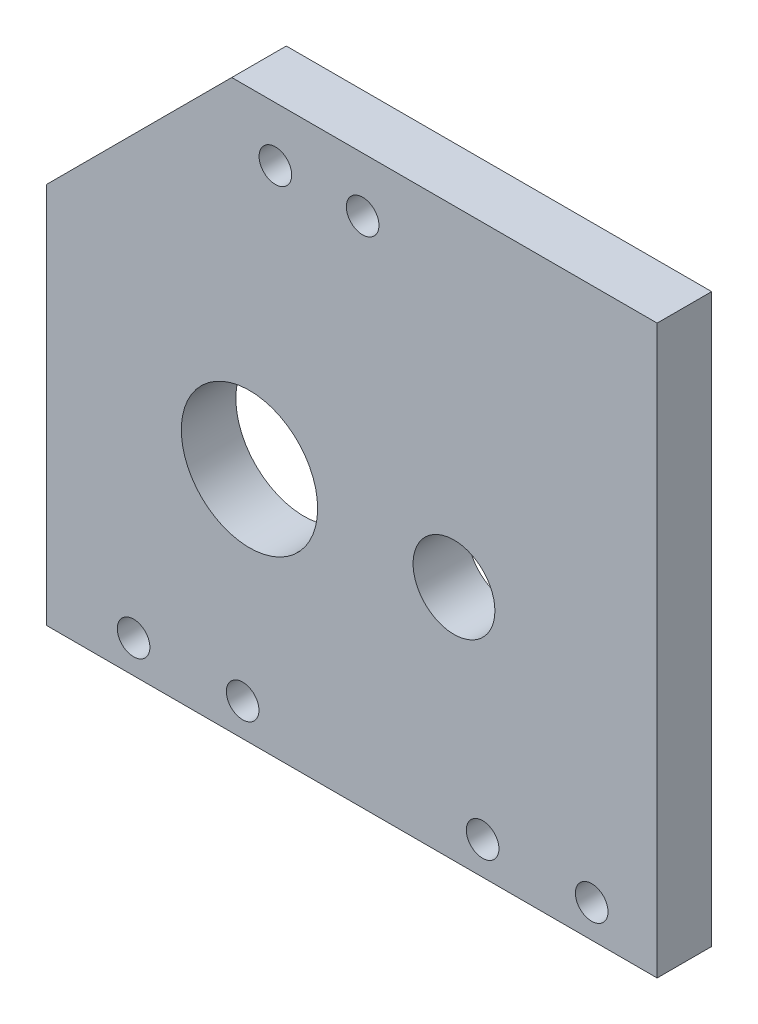
ISO-10303-21;
HEADER;
FILE_DESCRIPTION(('STEP AP214'),'2;1');
FILE_NAME('part.step','',(''),(''),'','','');
FILE_SCHEMA(('AUTOMOTIVE_DESIGN { 1 0 10303 214 1 1 1 1 }'));
ENDSEC;
DATA;
#1=APPLICATION_CONTEXT('core data for automotive mechanical design processes');
#2=APPLICATION_PROTOCOL_DEFINITION('international standard','automotive_design',2000,#1);
#3=PRODUCT_CONTEXT('',#1,'mechanical');
#4=PRODUCT('Part','Part','',(#3));
#5=PRODUCT_RELATED_PRODUCT_CATEGORY('part','',(#4));
#6=PRODUCT_DEFINITION_FORMATION('','',#4);
#7=PRODUCT_DEFINITION_CONTEXT('part definition',#1,'design');
#8=PRODUCT_DEFINITION('design','',#6,#7);
#9=PRODUCT_DEFINITION_SHAPE('','',#8);
#10=(LENGTH_UNIT() NAMED_UNIT(*) SI_UNIT(.MILLI.,.METRE.));
#11=(NAMED_UNIT(*) PLANE_ANGLE_UNIT() SI_UNIT($,.RADIAN.));
#12=(NAMED_UNIT(*) SI_UNIT($,.STERADIAN.) SOLID_ANGLE_UNIT());
#13=UNCERTAINTY_MEASURE_WITH_UNIT(LENGTH_MEASURE(1.E-05),#10,'distance_accuracy_value','');
#14=(GEOMETRIC_REPRESENTATION_CONTEXT(3) GLOBAL_UNCERTAINTY_ASSIGNED_CONTEXT((#13)) GLOBAL_UNIT_ASSIGNED_CONTEXT((#10,
#11,#12)) REPRESENTATION_CONTEXT('',''));
#15=CARTESIAN_POINT('',(0.,0.,0.));
#16=DIRECTION('',(0.,0.,1.));
#17=DIRECTION('',(1.,0.,0.));
#18=AXIS2_PLACEMENT_3D('',#15,#16,#17);
#19=CARTESIAN_POINT('',(0.,0.,6.35));
#20=DIRECTION('',(0.,0.,1.));
#21=DIRECTION('',(1.,0.,0.));
#22=AXIS2_PLACEMENT_3D('',#19,#20,#21);
#23=PLANE('',#22);
#24=CARTESIAN_POINT('',(-8.89,26.67,6.35));
#25=DIRECTION('',(0.,0.,1.));
#26=DIRECTION('',(1.,0.,0.));
#27=AXIS2_PLACEMENT_3D('',#24,#25,#26);
#28=CIRCLE('',#27,1.89864999999999);
#29=CARTESIAN_POINT('',(-6.99135000000001,26.67,6.35));
#30=VERTEX_POINT('',#29);
#31=EDGE_CURVE('E173',#30,#30,#28,.T.);
#32=ORIENTED_EDGE('',*,*,#31,.F.);
#33=EDGE_LOOP('',(#32));
#34=FACE_BOUND('',#33,.T.);
#35=CARTESIAN_POINT('',(1.27000000000001,26.67,6.35));
#36=DIRECTION('',(0.,0.,1.));
#37=DIRECTION('',(1.,0.,0.));
#38=AXIS2_PLACEMENT_3D('',#35,#36,#37);
#39=CIRCLE('',#38,1.89864999999999);
#40=CARTESIAN_POINT('',(3.16864999999999,26.67,6.35));
#41=VERTEX_POINT('',#40);
#42=EDGE_CURVE('E167',#41,#41,#39,.T.);
#43=ORIENTED_EDGE('',*,*,#42,.F.);
#44=EDGE_LOOP('',(#43));
#45=FACE_BOUND('',#44,.T.);
#46=DIRECTION('',(0.707106781186547,0.707106781186548,0.));
#47=VECTOR('',#46,1.);
#48=CARTESIAN_POINT('',(-13.97,33.02,6.35));
#49=LINE('',#48,#47);
#50=CARTESIAN_POINT('',(-35.56,11.43,6.35));
#51=VERTEX_POINT('',#50);
#52=CARTESIAN_POINT('',(-13.97,33.02,6.35));
#53=VERTEX_POINT('',#52);
#54=EDGE_CURVE('E48',#51,#53,#49,.T.);
#55=ORIENTED_EDGE('',*,*,#54,.F.);
#56=DIRECTION('',(0.,-1.,0.));
#57=VECTOR('',#56,1.);
#58=CARTESIAN_POINT('',(-35.56,-33.02,6.35));
#59=LINE('',#58,#57);
#60=CARTESIAN_POINT('',(-35.56,-33.02,6.35));
#61=VERTEX_POINT('',#60);
#62=EDGE_CURVE('E78',#51,#61,#59,.T.);
#63=ORIENTED_EDGE('',*,*,#62,.T.);
#64=DIRECTION('',(1.,0.,0.));
#65=VECTOR('',#64,1.);
#66=CARTESIAN_POINT('',(35.56,-33.02,6.35));
#67=LINE('',#66,#65);
#68=CARTESIAN_POINT('',(35.56,-33.02,6.35));
#69=VERTEX_POINT('',#68);
#70=EDGE_CURVE('E108',#61,#69,#67,.T.);
#71=ORIENTED_EDGE('',*,*,#70,.T.);
#72=DIRECTION('',(0.,1.,0.));
#73=VECTOR('',#72,1.);
#74=CARTESIAN_POINT('',(35.56,-33.02,6.35));
#75=LINE('',#74,#73);
#76=CARTESIAN_POINT('',(35.56,33.02,6.35));
#77=VERTEX_POINT('',#76);
#78=EDGE_CURVE('E57',#69,#77,#75,.T.);
#79=ORIENTED_EDGE('',*,*,#78,.T.);
#80=DIRECTION('',(-1.,0.,0.));
#81=VECTOR('',#80,1.);
#82=CARTESIAN_POINT('',(35.56,33.02,6.35));
#83=LINE('',#82,#81);
#84=EDGE_CURVE('E114',#77,#53,#83,.T.);
#85=ORIENTED_EDGE('',*,*,#84,.T.);
#86=EDGE_LOOP('',(#55,#63,#71,#79,#85));
#87=FACE_BOUND('',#86,.T.);
#88=CARTESIAN_POINT('',(-25.4,-29.21,6.35));
#89=DIRECTION('',(0.,0.,1.));
#90=DIRECTION('',(1.,0.,0.));
#91=AXIS2_PLACEMENT_3D('',#88,#89,#90);
#92=CIRCLE('',#91,1.89864999999999);
#93=CARTESIAN_POINT('',(-23.50135,-29.21,6.35));
#94=VERTEX_POINT('',#93);
#95=EDGE_CURVE('E159',#94,#94,#92,.T.);
#96=ORIENTED_EDGE('',*,*,#95,.F.);
#97=EDGE_LOOP('',(#96));
#98=FACE_BOUND('',#97,.T.);
#99=CARTESIAN_POINT('',(-12.7,-29.21,6.35));
#100=DIRECTION('',(0.,0.,1.));
#101=DIRECTION('',(1.,0.,0.));
#102=AXIS2_PLACEMENT_3D('',#99,#100,#101);
#103=CIRCLE('',#102,1.89864999999999);
#104=CARTESIAN_POINT('',(-10.80135,-29.21,6.35));
#105=VERTEX_POINT('',#104);
#106=EDGE_CURVE('E153',#105,#105,#103,.T.);
#107=ORIENTED_EDGE('',*,*,#106,.F.);
#108=EDGE_LOOP('',(#107));
#109=FACE_BOUND('',#108,.T.);
#110=CARTESIAN_POINT('',(15.24,-29.21,6.35));
#111=DIRECTION('',(0.,0.,1.));
#112=DIRECTION('',(1.,0.,0.));
#113=AXIS2_PLACEMENT_3D('',#110,#111,#112);
#114=CIRCLE('',#113,1.89864999999999);
#115=CARTESIAN_POINT('',(17.13865,-29.21,6.35));
#116=VERTEX_POINT('',#115);
#117=EDGE_CURVE('E147',#116,#116,#114,.T.);
#118=ORIENTED_EDGE('',*,*,#117,.F.);
#119=EDGE_LOOP('',(#118));
#120=FACE_BOUND('',#119,.T.);
#121=CARTESIAN_POINT('',(27.94,-29.21,6.35));
#122=DIRECTION('',(0.,0.,1.));
#123=DIRECTION('',(1.,0.,0.));
#124=AXIS2_PLACEMENT_3D('',#121,#122,#123);
#125=CIRCLE('',#124,1.89864999999999);
#126=CARTESIAN_POINT('',(29.83865,-29.21,6.35));
#127=VERTEX_POINT('',#126);
#128=EDGE_CURVE('E141',#127,#127,#125,.T.);
#129=ORIENTED_EDGE('',*,*,#128,.F.);
#130=EDGE_LOOP('',(#129));
#131=FACE_BOUND('',#130,.T.);
#132=CARTESIAN_POINT('',(-11.90625,-5.43814,6.35));
#133=DIRECTION('',(0.,0.,1.));
#134=DIRECTION('',(1.,0.,0.));
#135=AXIS2_PLACEMENT_3D('',#132,#133,#134);
#136=CIRCLE('',#135,7.9375);
#137=CARTESIAN_POINT('',(-3.96875,-5.43814,6.35));
#138=VERTEX_POINT('',#137);
#139=EDGE_CURVE('E121',#138,#138,#136,.T.);
#140=ORIENTED_EDGE('',*,*,#139,.F.);
#141=EDGE_LOOP('',(#140));
#142=FACE_BOUND('',#141,.T.);
#143=CARTESIAN_POINT('',(11.90625,-5.43814,6.35));
#144=DIRECTION('',(0.,0.,1.));
#145=DIRECTION('',(1.,0.,0.));
#146=AXIS2_PLACEMENT_3D('',#143,#144,#145);
#147=CIRCLE('',#146,4.7625);
#148=CARTESIAN_POINT('',(16.66875,-5.43814,6.35));
#149=VERTEX_POINT('',#148);
#150=EDGE_CURVE('E131',#149,#149,#147,.T.);
#151=ORIENTED_EDGE('',*,*,#150,.F.);
#152=EDGE_LOOP('',(#151));
#153=FACE_BOUND('',#152,.T.);
#154=ADVANCED_FACE('F33',(#34,#45,#87,#98,#109,#120,#131,#142,#153),#23,.T.);
#155=CARTESIAN_POINT('',(0.,0.,0.));
#156=DIRECTION('',(0.,0.,1.));
#157=DIRECTION('',(1.,0.,0.));
#158=AXIS2_PLACEMENT_3D('',#155,#156,#157);
#159=PLANE('',#158);
#160=CARTESIAN_POINT('',(-8.89,26.67,0.));
#161=DIRECTION('',(0.,0.,1.));
#162=DIRECTION('',(1.,0.,0.));
#163=AXIS2_PLACEMENT_3D('',#160,#161,#162);
#164=CIRCLE('',#163,1.89864999999999);
#165=CARTESIAN_POINT('',(-6.99135000000001,26.67,0.));
#166=VERTEX_POINT('',#165);
#167=EDGE_CURVE('E170',#166,#166,#164,.T.);
#168=ORIENTED_EDGE('',*,*,#167,.T.);
#169=EDGE_LOOP('',(#168));
#170=FACE_BOUND('',#169,.T.);
#171=CARTESIAN_POINT('',(1.27000000000001,26.67,0.));
#172=DIRECTION('',(0.,0.,1.));
#173=DIRECTION('',(1.,0.,0.));
#174=AXIS2_PLACEMENT_3D('',#171,#172,#173);
#175=CIRCLE('',#174,1.89864999999999);
#176=CARTESIAN_POINT('',(3.16864999999999,26.67,0.));
#177=VERTEX_POINT('',#176);
#178=EDGE_CURVE('E163',#177,#177,#175,.T.);
#179=ORIENTED_EDGE('',*,*,#178,.T.);
#180=EDGE_LOOP('',(#179));
#181=FACE_BOUND('',#180,.T.);
#182=CARTESIAN_POINT('',(-25.4,-29.21,0.));
#183=DIRECTION('',(0.,0.,1.));
#184=DIRECTION('',(1.,0.,0.));
#185=AXIS2_PLACEMENT_3D('',#182,#183,#184);
#186=CIRCLE('',#185,1.89864999999999);
#187=CARTESIAN_POINT('',(-23.50135,-29.21,0.));
#188=VERTEX_POINT('',#187);
#189=EDGE_CURVE('E156',#188,#188,#186,.T.);
#190=ORIENTED_EDGE('',*,*,#189,.T.);
#191=EDGE_LOOP('',(#190));
#192=FACE_BOUND('',#191,.T.);
#193=CARTESIAN_POINT('',(-12.7,-29.21,0.));
#194=DIRECTION('',(0.,0.,1.));
#195=DIRECTION('',(1.,0.,0.));
#196=AXIS2_PLACEMENT_3D('',#193,#194,#195);
#197=CIRCLE('',#196,1.89864999999999);
#198=CARTESIAN_POINT('',(-10.80135,-29.21,0.));
#199=VERTEX_POINT('',#198);
#200=EDGE_CURVE('E150',#199,#199,#197,.T.);
#201=ORIENTED_EDGE('',*,*,#200,.T.);
#202=EDGE_LOOP('',(#201));
#203=FACE_BOUND('',#202,.T.);
#204=CARTESIAN_POINT('',(15.24,-29.21,0.));
#205=DIRECTION('',(0.,0.,1.));
#206=DIRECTION('',(1.,0.,0.));
#207=AXIS2_PLACEMENT_3D('',#204,#205,#206);
#208=CIRCLE('',#207,1.89864999999999);
#209=CARTESIAN_POINT('',(17.13865,-29.21,0.));
#210=VERTEX_POINT('',#209);
#211=EDGE_CURVE('E144',#210,#210,#208,.T.);
#212=ORIENTED_EDGE('',*,*,#211,.T.);
#213=EDGE_LOOP('',(#212));
#214=FACE_BOUND('',#213,.T.);
#215=CARTESIAN_POINT('',(27.94,-29.21,0.));
#216=DIRECTION('',(0.,0.,1.));
#217=DIRECTION('',(1.,0.,0.));
#218=AXIS2_PLACEMENT_3D('',#215,#216,#217);
#219=CIRCLE('',#218,1.89864999999999);
#220=CARTESIAN_POINT('',(29.83865,-29.21,0.));
#221=VERTEX_POINT('',#220);
#222=EDGE_CURVE('E136',#221,#221,#219,.T.);
#223=ORIENTED_EDGE('',*,*,#222,.T.);
#224=EDGE_LOOP('',(#223));
#225=FACE_BOUND('',#224,.T.);
#226=DIRECTION('',(0.,-1.,0.));
#227=VECTOR('',#226,1.);
#228=CARTESIAN_POINT('',(-35.56,-33.02,0.));
#229=LINE('',#228,#227);
#230=CARTESIAN_POINT('',(-35.56,11.43,0.));
#231=VERTEX_POINT('',#230);
#232=CARTESIAN_POINT('',(-35.56,-33.02,0.));
#233=VERTEX_POINT('',#232);
#234=EDGE_CURVE('E103',#231,#233,#229,.T.);
#235=ORIENTED_EDGE('',*,*,#234,.F.);
#236=DIRECTION('',(0.707106781186547,0.707106781186548,0.));
#237=VECTOR('',#236,1.);
#238=CARTESIAN_POINT('',(-13.97,33.02,0.));
#239=LINE('',#238,#237);
#240=CARTESIAN_POINT('',(-13.97,33.02,0.));
#241=VERTEX_POINT('',#240);
#242=EDGE_CURVE('E89',#231,#241,#239,.T.);
#243=ORIENTED_EDGE('',*,*,#242,.T.);
#244=DIRECTION('',(-1.,0.,0.));
#245=VECTOR('',#244,1.);
#246=CARTESIAN_POINT('',(35.56,33.02,0.));
#247=LINE('',#246,#245);
#248=CARTESIAN_POINT('',(35.56,33.02,0.));
#249=VERTEX_POINT('',#248);
#250=EDGE_CURVE('E101',#249,#241,#247,.T.);
#251=ORIENTED_EDGE('',*,*,#250,.F.);
#252=DIRECTION('',(0.,1.,0.));
#253=VECTOR('',#252,1.);
#254=CARTESIAN_POINT('',(35.56,-33.02,0.));
#255=LINE('',#254,#253);
#256=CARTESIAN_POINT('',(35.56,-33.02,0.));
#257=VERTEX_POINT('',#256);
#258=EDGE_CURVE('E74',#257,#249,#255,.T.);
#259=ORIENTED_EDGE('',*,*,#258,.F.);
#260=DIRECTION('',(1.,0.,0.));
#261=VECTOR('',#260,1.);
#262=CARTESIAN_POINT('',(35.56,-33.02,0.));
#263=LINE('',#262,#261);
#264=EDGE_CURVE('E110',#233,#257,#263,.T.);
#265=ORIENTED_EDGE('',*,*,#264,.F.);
#266=EDGE_LOOP('',(#235,#243,#251,#259,#265));
#267=FACE_BOUND('',#266,.T.);
#268=CARTESIAN_POINT('',(-11.90625,-5.43814,0.));
#269=DIRECTION('',(0.,0.,1.));
#270=DIRECTION('',(1.,0.,0.));
#271=AXIS2_PLACEMENT_3D('',#268,#269,#270);
#272=CIRCLE('',#271,7.9375);
#273=CARTESIAN_POINT('',(-3.96875,-5.43814,0.));
#274=VERTEX_POINT('',#273);
#275=EDGE_CURVE('E124',#274,#274,#272,.T.);
#276=ORIENTED_EDGE('',*,*,#275,.T.);
#277=EDGE_LOOP('',(#276));
#278=FACE_BOUND('',#277,.T.);
#279=CARTESIAN_POINT('',(11.90625,-5.43814,0.));
#280=DIRECTION('',(0.,0.,1.));
#281=DIRECTION('',(1.,0.,0.));
#282=AXIS2_PLACEMENT_3D('',#279,#280,#281);
#283=CIRCLE('',#282,4.7625);
#284=CARTESIAN_POINT('',(16.66875,-5.43814,0.));
#285=VERTEX_POINT('',#284);
#286=EDGE_CURVE('E133',#285,#285,#283,.T.);
#287=ORIENTED_EDGE('',*,*,#286,.T.);
#288=EDGE_LOOP('',(#287));
#289=FACE_BOUND('',#288,.T.);
#290=ADVANCED_FACE('F99',(#170,#181,#192,#203,#214,#225,#267,#278,#289),#159,.F.);
#291=CARTESIAN_POINT('',(-35.56,-33.02,6.35));
#292=DIRECTION('',(1.,0.,0.));
#293=DIRECTION('',(0.,0.,-1.));
#294=AXIS2_PLACEMENT_3D('',#291,#292,#293);
#295=PLANE('',#294);
#296=ORIENTED_EDGE('',*,*,#62,.F.);
#297=DIRECTION('',(0.,0.,1.));
#298=VECTOR('',#297,1.);
#299=CARTESIAN_POINT('',(-35.56,11.43,0.));
#300=LINE('',#299,#298);
#301=EDGE_CURVE('E94',#231,#51,#300,.T.);
#302=ORIENTED_EDGE('',*,*,#301,.F.);
#303=ORIENTED_EDGE('',*,*,#234,.T.);
#304=DIRECTION('',(0.,0.,-1.));
#305=VECTOR('',#304,1.);
#306=CARTESIAN_POINT('',(-35.56,-33.02,6.35));
#307=LINE('',#306,#305);
#308=EDGE_CURVE('E11',#61,#233,#307,.T.);
#309=ORIENTED_EDGE('',*,*,#308,.F.);
#310=EDGE_LOOP('',(#296,#302,#303,#309));
#311=FACE_BOUND('',#310,.T.);
#312=ADVANCED_FACE('F35',(#311),#295,.F.);
#313=CARTESIAN_POINT('',(35.56,-33.02,6.35));
#314=DIRECTION('',(0.,1.,0.));
#315=DIRECTION('',(-1.,0.,0.));
#316=AXIS2_PLACEMENT_3D('',#313,#314,#315);
#317=PLANE('',#316);
#318=ORIENTED_EDGE('',*,*,#264,.T.);
#319=DIRECTION('',(0.,0.,-1.));
#320=VECTOR('',#319,1.);
#321=CARTESIAN_POINT('',(35.56,-33.02,6.35));
#322=LINE('',#321,#320);
#323=EDGE_CURVE('E41',#69,#257,#322,.T.);
#324=ORIENTED_EDGE('',*,*,#323,.F.);
#325=ORIENTED_EDGE('',*,*,#70,.F.);
#326=ORIENTED_EDGE('',*,*,#308,.T.);
#327=EDGE_LOOP('',(#318,#324,#325,#326));
#328=FACE_BOUND('',#327,.T.);
#329=ADVANCED_FACE('F119',(#328),#317,.F.);
#330=CARTESIAN_POINT('',(35.56,-33.02,6.35));
#331=DIRECTION('',(-1.,0.,0.));
#332=DIRECTION('',(0.,0.,1.));
#333=AXIS2_PLACEMENT_3D('',#330,#331,#332);
#334=PLANE('',#333);
#335=ORIENTED_EDGE('',*,*,#258,.T.);
#336=DIRECTION('',(0.,0.,-1.));
#337=VECTOR('',#336,1.);
#338=CARTESIAN_POINT('',(35.56,33.02,6.35));
#339=LINE('',#338,#337);
#340=EDGE_CURVE('E106',#77,#249,#339,.T.);
#341=ORIENTED_EDGE('',*,*,#340,.F.);
#342=ORIENTED_EDGE('',*,*,#78,.F.);
#343=ORIENTED_EDGE('',*,*,#323,.T.);
#344=EDGE_LOOP('',(#335,#341,#342,#343));
#345=FACE_BOUND('',#344,.T.);
#346=ADVANCED_FACE('F116',(#345),#334,.F.);
#347=CARTESIAN_POINT('',(35.56,33.02,6.35));
#348=DIRECTION('',(0.,-1.,0.));
#349=DIRECTION('',(1.,0.,0.));
#350=AXIS2_PLACEMENT_3D('',#347,#348,#349);
#351=PLANE('',#350);
#352=ORIENTED_EDGE('',*,*,#250,.T.);
#353=DIRECTION('',(0.,0.,1.));
#354=VECTOR('',#353,1.);
#355=CARTESIAN_POINT('',(-13.97,33.02,0.));
#356=LINE('',#355,#354);
#357=EDGE_CURVE('E86',#241,#53,#356,.T.);
#358=ORIENTED_EDGE('',*,*,#357,.T.);
#359=ORIENTED_EDGE('',*,*,#84,.F.);
#360=ORIENTED_EDGE('',*,*,#340,.T.);
#361=EDGE_LOOP('',(#352,#358,#359,#360));
#362=FACE_BOUND('',#361,.T.);
#363=ADVANCED_FACE('F105',(#362),#351,.F.);
#364=CARTESIAN_POINT('',(-11.90625,-5.43814,6.35));
#365=DIRECTION('',(0.,0.,-1.));
#366=DIRECTION('',(-1.,0.,0.));
#367=AXIS2_PLACEMENT_3D('',#364,#365,#366);
#368=CYLINDRICAL_SURFACE('',#367,7.9375);
#369=ORIENTED_EDGE('',*,*,#139,.T.);
#370=EDGE_LOOP('',(#369));
#371=FACE_BOUND('',#370,.T.);
#372=ORIENTED_EDGE('',*,*,#275,.F.);
#373=EDGE_LOOP('',(#372));
#374=FACE_BOUND('',#373,.T.);
#375=ADVANCED_FACE('F200',(#371,#374),#368,.F.);
#376=CARTESIAN_POINT('',(11.90625,-5.43814,6.35));
#377=DIRECTION('',(0.,0.,-1.));
#378=DIRECTION('',(-1.,0.,0.));
#379=AXIS2_PLACEMENT_3D('',#376,#377,#378);
#380=CYLINDRICAL_SURFACE('',#379,4.7625);
#381=ORIENTED_EDGE('',*,*,#150,.T.);
#382=EDGE_LOOP('',(#381));
#383=FACE_BOUND('',#382,.T.);
#384=ORIENTED_EDGE('',*,*,#286,.F.);
#385=EDGE_LOOP('',(#384));
#386=FACE_BOUND('',#385,.T.);
#387=ADVANCED_FACE('F196',(#383,#386),#380,.F.);
#388=CARTESIAN_POINT('',(27.94,-29.21,6.35));
#389=DIRECTION('',(0.,0.,1.));
#390=DIRECTION('',(1.,0.,0.));
#391=AXIS2_PLACEMENT_3D('',#388,#389,#390);
#392=CYLINDRICAL_SURFACE('',#391,1.89864999999999);
#393=ORIENTED_EDGE('',*,*,#222,.F.);
#394=EDGE_LOOP('',(#393));
#395=FACE_BOUND('',#394,.T.);
#396=ORIENTED_EDGE('',*,*,#128,.T.);
#397=EDGE_LOOP('',(#396));
#398=FACE_BOUND('',#397,.T.);
#399=ADVANCED_FACE('F199',(#395,#398),#392,.F.);
#400=CARTESIAN_POINT('',(15.24,-29.21,6.35));
#401=DIRECTION('',(0.,0.,1.));
#402=DIRECTION('',(1.,0.,0.));
#403=AXIS2_PLACEMENT_3D('',#400,#401,#402);
#404=CYLINDRICAL_SURFACE('',#403,1.89864999999999);
#405=ORIENTED_EDGE('',*,*,#211,.F.);
#406=EDGE_LOOP('',(#405));
#407=FACE_BOUND('',#406,.T.);
#408=ORIENTED_EDGE('',*,*,#117,.T.);
#409=EDGE_LOOP('',(#408));
#410=FACE_BOUND('',#409,.T.);
#411=ADVANCED_FACE('F247',(#407,#410),#404,.F.);
#412=CARTESIAN_POINT('',(-12.7,-29.21,6.35));
#413=DIRECTION('',(0.,0.,1.));
#414=DIRECTION('',(1.,0.,0.));
#415=AXIS2_PLACEMENT_3D('',#412,#413,#414);
#416=CYLINDRICAL_SURFACE('',#415,1.89864999999999);
#417=ORIENTED_EDGE('',*,*,#200,.F.);
#418=EDGE_LOOP('',(#417));
#419=FACE_BOUND('',#418,.T.);
#420=ORIENTED_EDGE('',*,*,#106,.T.);
#421=EDGE_LOOP('',(#420));
#422=FACE_BOUND('',#421,.T.);
#423=ADVANCED_FACE('F255',(#419,#422),#416,.F.);
#424=CARTESIAN_POINT('',(-25.4,-29.21,6.35));
#425=DIRECTION('',(0.,0.,1.));
#426=DIRECTION('',(1.,0.,0.));
#427=AXIS2_PLACEMENT_3D('',#424,#425,#426);
#428=CYLINDRICAL_SURFACE('',#427,1.89864999999999);
#429=ORIENTED_EDGE('',*,*,#189,.F.);
#430=EDGE_LOOP('',(#429));
#431=FACE_BOUND('',#430,.T.);
#432=ORIENTED_EDGE('',*,*,#95,.T.);
#433=EDGE_LOOP('',(#432));
#434=FACE_BOUND('',#433,.T.);
#435=ADVANCED_FACE('F263',(#431,#434),#428,.F.);
#436=CARTESIAN_POINT('',(-13.97,33.02,0.));
#437=DIRECTION('',(0.707106781186548,-0.707106781186547,0.));
#438=DIRECTION('',(0.707106781186547,0.707106781186548,0.));
#439=AXIS2_PLACEMENT_3D('',#436,#437,#438);
#440=PLANE('',#439);
#441=ORIENTED_EDGE('',*,*,#54,.T.);
#442=ORIENTED_EDGE('',*,*,#357,.F.);
#443=ORIENTED_EDGE('',*,*,#242,.F.);
#444=ORIENTED_EDGE('',*,*,#301,.T.);
#445=EDGE_LOOP('',(#441,#442,#443,#444));
#446=FACE_BOUND('',#445,.T.);
#447=ADVANCED_FACE('F88',(#446),#440,.F.);
#448=CARTESIAN_POINT('',(1.27000000000001,26.67,6.35));
#449=DIRECTION('',(0.,0.,1.));
#450=DIRECTION('',(1.,0.,0.));
#451=AXIS2_PLACEMENT_3D('',#448,#449,#450);
#452=CYLINDRICAL_SURFACE('',#451,1.89864999999999);
#453=ORIENTED_EDGE('',*,*,#178,.F.);
#454=EDGE_LOOP('',(#453));
#455=FACE_BOUND('',#454,.T.);
#456=ORIENTED_EDGE('',*,*,#42,.T.);
#457=EDGE_LOOP('',(#456));
#458=FACE_BOUND('',#457,.T.);
#459=ADVANCED_FACE('F277',(#455,#458),#452,.F.);
#460=CARTESIAN_POINT('',(-8.89,26.67,6.35));
#461=DIRECTION('',(0.,0.,1.));
#462=DIRECTION('',(1.,0.,0.));
#463=AXIS2_PLACEMENT_3D('',#460,#461,#462);
#464=CYLINDRICAL_SURFACE('',#463,1.89864999999999);
#465=ORIENTED_EDGE('',*,*,#167,.F.);
#466=EDGE_LOOP('',(#465));
#467=FACE_BOUND('',#466,.T.);
#468=ORIENTED_EDGE('',*,*,#31,.T.);
#469=EDGE_LOOP('',(#468));
#470=FACE_BOUND('',#469,.T.);
#471=ADVANCED_FACE('F177',(#467,#470),#464,.F.);
#472=CLOSED_SHELL('',(#154,#290,#312,#329,#346,#363,#375,#387,#399,#411,#423,#435,#447,#459,#471));
#473=MANIFOLD_SOLID_BREP('B2',#472);
#474=ADVANCED_BREP_SHAPE_REPRESENTATION('',(#18,#473),#14);
#475=SHAPE_DEFINITION_REPRESENTATION(#9,#474);
ENDSEC;
END-ISO-10303-21;
